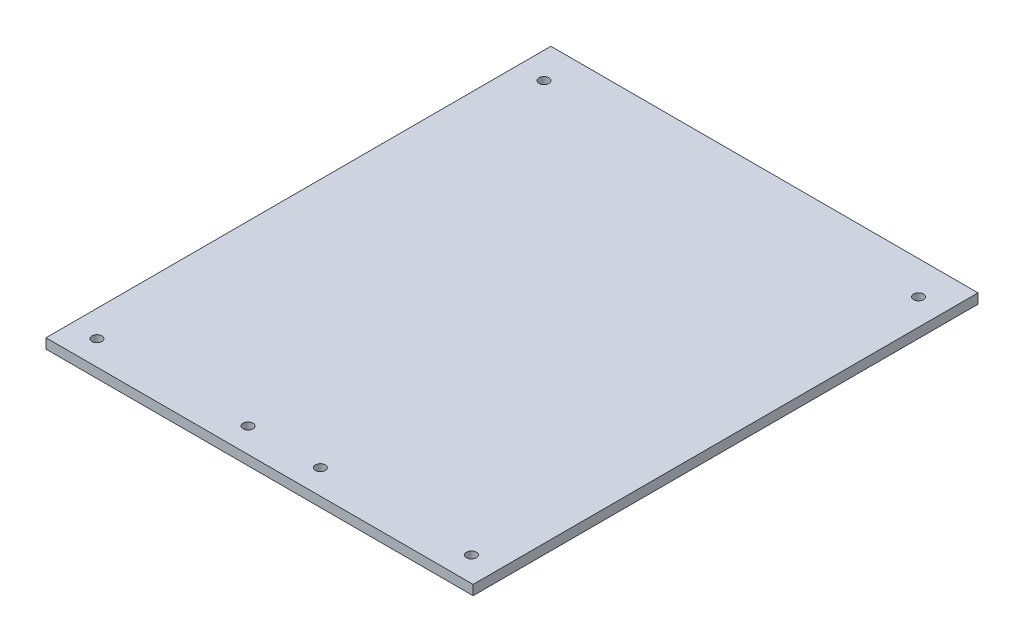
ISO-10303-21;
HEADER;
FILE_DESCRIPTION(('STEP AP214'),'2;1');
FILE_NAME('part.step','',(''),(''),'','','');
FILE_SCHEMA(('AUTOMOTIVE_DESIGN { 1 0 10303 214 1 1 1 1 }'));
ENDSEC;
DATA;
#1=APPLICATION_CONTEXT('core data for automotive mechanical design processes');
#2=APPLICATION_PROTOCOL_DEFINITION('international standard','automotive_design',2000,#1);
#3=PRODUCT_CONTEXT('',#1,'mechanical');
#4=PRODUCT('Part','Part','',(#3));
#5=PRODUCT_RELATED_PRODUCT_CATEGORY('part','',(#4));
#6=PRODUCT_DEFINITION_FORMATION('','',#4);
#7=PRODUCT_DEFINITION_CONTEXT('part definition',#1,'design');
#8=PRODUCT_DEFINITION('design','',#6,#7);
#9=PRODUCT_DEFINITION_SHAPE('','',#8);
#10=(LENGTH_UNIT() NAMED_UNIT(*) SI_UNIT(.MILLI.,.METRE.));
#11=(NAMED_UNIT(*) PLANE_ANGLE_UNIT() SI_UNIT($,.RADIAN.));
#12=(NAMED_UNIT(*) SI_UNIT($,.STERADIAN.) SOLID_ANGLE_UNIT());
#13=UNCERTAINTY_MEASURE_WITH_UNIT(LENGTH_MEASURE(1.E-05),#10,'distance_accuracy_value','');
#14=(GEOMETRIC_REPRESENTATION_CONTEXT(3) GLOBAL_UNCERTAINTY_ASSIGNED_CONTEXT((#13)) GLOBAL_UNIT_ASSIGNED_CONTEXT((#10,
#11,#12)) REPRESENTATION_CONTEXT('',''));
#15=CARTESIAN_POINT('',(0.,0.,0.));
#16=DIRECTION('',(0.,0.,1.));
#17=DIRECTION('',(1.,0.,0.));
#18=AXIS2_PLACEMENT_3D('',#15,#16,#17);
#19=CARTESIAN_POINT('',(0.,3.,0.));
#20=DIRECTION('',(0.,-1.,0.));
#21=DIRECTION('',(0.,0.,-1.));
#22=AXIS2_PLACEMENT_3D('',#19,#20,#21);
#23=PLANE('',#22);
#24=DIRECTION('',(0.,0.,1.));
#25=VECTOR('',#24,1.);
#26=CARTESIAN_POINT('',(0.,3.,0.));
#27=LINE('',#26,#25);
#28=CARTESIAN_POINT('',(0.,3.,-153.666));
#29=VERTEX_POINT('',#28);
#30=CARTESIAN_POINT('',(0.,3.,0.));
#31=VERTEX_POINT('',#30);
#32=EDGE_CURVE('E89',#29,#31,#27,.T.);
#33=ORIENTED_EDGE('',*,*,#32,.T.);
#34=DIRECTION('',(1.,0.,0.));
#35=VECTOR('',#34,1.);
#36=CARTESIAN_POINT('',(0.,3.,0.));
#37=LINE('',#36,#35);
#38=CARTESIAN_POINT('',(130.,3.,0.));
#39=VERTEX_POINT('',#38);
#40=EDGE_CURVE('E84',#31,#39,#37,.T.);
#41=ORIENTED_EDGE('',*,*,#40,.T.);
#42=DIRECTION('',(0.,0.,-1.));
#43=VECTOR('',#42,1.);
#44=CARTESIAN_POINT('',(130.,3.,0.));
#45=LINE('',#44,#43);
#46=CARTESIAN_POINT('',(130.,3.,-153.666));
#47=VERTEX_POINT('',#46);
#48=EDGE_CURVE('E87',#39,#47,#45,.T.);
#49=ORIENTED_EDGE('',*,*,#48,.T.);
#50=DIRECTION('',(-1.,0.,0.));
#51=VECTOR('',#50,1.);
#52=CARTESIAN_POINT('',(0.,3.,-153.666));
#53=LINE('',#52,#51);
#54=EDGE_CURVE('E54',#47,#29,#53,.T.);
#55=ORIENTED_EDGE('',*,*,#54,.T.);
#56=EDGE_LOOP('',(#33,#41,#49,#55));
#57=FACE_BOUND('',#56,.T.);
#58=CARTESIAN_POINT('',(8.,3.,-143.566));
#59=DIRECTION('',(0.,1.,0.));
#60=DIRECTION('',(0.,0.,1.));
#61=AXIS2_PLACEMENT_3D('',#58,#59,#60);
#62=CIRCLE('',#61,1.5);
#63=CARTESIAN_POINT('',(8.,3.,-142.066));
#64=VERTEX_POINT('',#63);
#65=EDGE_CURVE('E104',#64,#64,#62,.T.);
#66=ORIENTED_EDGE('',*,*,#65,.F.);
#67=EDGE_LOOP('',(#66));
#68=FACE_BOUND('',#67,.T.);
#69=CARTESIAN_POINT('',(8.,3.,-7.5));
#70=DIRECTION('',(0.,1.,0.));
#71=DIRECTION('',(0.,0.,1.));
#72=AXIS2_PLACEMENT_3D('',#69,#70,#71);
#73=CIRCLE('',#72,1.5);
#74=CARTESIAN_POINT('',(8.,3.,-6.));
#75=VERTEX_POINT('',#74);
#76=EDGE_CURVE('E119',#75,#75,#73,.T.);
#77=ORIENTED_EDGE('',*,*,#76,.F.);
#78=EDGE_LOOP('',(#77));
#79=FACE_BOUND('',#78,.T.);
#80=CARTESIAN_POINT('',(54.,3.,-7.5));
#81=DIRECTION('',(0.,1.,0.));
#82=DIRECTION('',(0.,0.,1.));
#83=AXIS2_PLACEMENT_3D('',#80,#81,#82);
#84=CIRCLE('',#83,1.5);
#85=CARTESIAN_POINT('',(54.,3.,-6.));
#86=VERTEX_POINT('',#85);
#87=EDGE_CURVE('E125',#86,#86,#84,.T.);
#88=ORIENTED_EDGE('',*,*,#87,.F.);
#89=EDGE_LOOP('',(#88));
#90=FACE_BOUND('',#89,.T.);
#91=CARTESIAN_POINT('',(122.,3.,-7.5));
#92=DIRECTION('',(0.,1.,0.));
#93=DIRECTION('',(0.,0.,-1.));
#94=AXIS2_PLACEMENT_3D('',#91,#92,#93);
#95=CIRCLE('',#94,1.5);
#96=CARTESIAN_POINT('',(122.,3.,-9.));
#97=VERTEX_POINT('',#96);
#98=EDGE_CURVE('E131',#97,#97,#95,.T.);
#99=ORIENTED_EDGE('',*,*,#98,.F.);
#100=EDGE_LOOP('',(#99));
#101=FACE_BOUND('',#100,.T.);
#102=CARTESIAN_POINT('',(76.,3.,-7.5));
#103=DIRECTION('',(0.,1.,0.));
#104=DIRECTION('',(0.,0.,-1.));
#105=AXIS2_PLACEMENT_3D('',#102,#103,#104);
#106=CIRCLE('',#105,1.50000000000001);
#107=CARTESIAN_POINT('',(76.,3.,-9.00000000000001));
#108=VERTEX_POINT('',#107);
#109=EDGE_CURVE('E137',#108,#108,#106,.T.);
#110=ORIENTED_EDGE('',*,*,#109,.F.);
#111=EDGE_LOOP('',(#110));
#112=FACE_BOUND('',#111,.T.);
#113=CARTESIAN_POINT('',(122.,3.,-143.566));
#114=DIRECTION('',(0.,1.,0.));
#115=DIRECTION('',(0.,0.,-1.));
#116=AXIS2_PLACEMENT_3D('',#113,#114,#115);
#117=CIRCLE('',#116,1.5);
#118=CARTESIAN_POINT('',(122.,3.,-145.066));
#119=VERTEX_POINT('',#118);
#120=EDGE_CURVE('E143',#119,#119,#117,.T.);
#121=ORIENTED_EDGE('',*,*,#120,.F.);
#122=EDGE_LOOP('',(#121));
#123=FACE_BOUND('',#122,.T.);
#124=ADVANCED_FACE('F37',(#57,#68,#79,#90,#101,#112,#123),#23,.F.);
#125=CARTESIAN_POINT('',(0.,0.,0.));
#126=DIRECTION('',(0.,-1.,0.));
#127=DIRECTION('',(0.,0.,-1.));
#128=AXIS2_PLACEMENT_3D('',#125,#126,#127);
#129=PLANE('',#128);
#130=CARTESIAN_POINT('',(76.,0.,-7.5));
#131=DIRECTION('',(0.,1.,0.));
#132=DIRECTION('',(0.,0.,-1.));
#133=AXIS2_PLACEMENT_3D('',#130,#131,#132);
#134=CIRCLE('',#133,1.50000000000001);
#135=CARTESIAN_POINT('',(76.,0.,-9.00000000000001));
#136=VERTEX_POINT('',#135);
#137=EDGE_CURVE('E140',#136,#136,#134,.T.);
#138=ORIENTED_EDGE('',*,*,#137,.T.);
#139=EDGE_LOOP('',(#138));
#140=FACE_BOUND('',#139,.T.);
#141=CARTESIAN_POINT('',(54.,0.,-7.5));
#142=DIRECTION('',(0.,1.,0.));
#143=DIRECTION('',(0.,0.,1.));
#144=AXIS2_PLACEMENT_3D('',#141,#142,#143);
#145=CIRCLE('',#144,1.5);
#146=CARTESIAN_POINT('',(54.,0.,-6.));
#147=VERTEX_POINT('',#146);
#148=EDGE_CURVE('E128',#147,#147,#145,.T.);
#149=ORIENTED_EDGE('',*,*,#148,.T.);
#150=EDGE_LOOP('',(#149));
#151=FACE_BOUND('',#150,.T.);
#152=CARTESIAN_POINT('',(8.,0.,-143.566));
#153=DIRECTION('',(0.,1.,0.));
#154=DIRECTION('',(0.,0.,1.));
#155=AXIS2_PLACEMENT_3D('',#152,#153,#154);
#156=CIRCLE('',#155,1.5);
#157=CARTESIAN_POINT('',(8.,0.,-142.066));
#158=VERTEX_POINT('',#157);
#159=EDGE_CURVE('E116',#158,#158,#156,.T.);
#160=ORIENTED_EDGE('',*,*,#159,.T.);
#161=EDGE_LOOP('',(#160));
#162=FACE_BOUND('',#161,.T.);
#163=DIRECTION('',(0.,0.,1.));
#164=VECTOR('',#163,1.);
#165=CARTESIAN_POINT('',(0.,0.,0.));
#166=LINE('',#165,#164);
#167=CARTESIAN_POINT('',(0.,0.,-153.666));
#168=VERTEX_POINT('',#167);
#169=CARTESIAN_POINT('',(0.,0.,0.));
#170=VERTEX_POINT('',#169);
#171=EDGE_CURVE('E101',#168,#170,#166,.T.);
#172=ORIENTED_EDGE('',*,*,#171,.F.);
#173=DIRECTION('',(-1.,0.,0.));
#174=VECTOR('',#173,1.);
#175=CARTESIAN_POINT('',(0.,0.,-153.666));
#176=LINE('',#175,#174);
#177=CARTESIAN_POINT('',(130.,0.,-153.666));
#178=VERTEX_POINT('',#177);
#179=EDGE_CURVE('E77',#178,#168,#176,.T.);
#180=ORIENTED_EDGE('',*,*,#179,.F.);
#181=DIRECTION('',(0.,0.,-1.));
#182=VECTOR('',#181,1.);
#183=CARTESIAN_POINT('',(130.,0.,0.));
#184=LINE('',#183,#182);
#185=CARTESIAN_POINT('',(130.,0.,0.));
#186=VERTEX_POINT('',#185);
#187=EDGE_CURVE('E71',#186,#178,#184,.T.);
#188=ORIENTED_EDGE('',*,*,#187,.F.);
#189=DIRECTION('',(1.,0.,0.));
#190=VECTOR('',#189,1.);
#191=CARTESIAN_POINT('',(0.,0.,0.));
#192=LINE('',#191,#190);
#193=EDGE_CURVE('E93',#170,#186,#192,.T.);
#194=ORIENTED_EDGE('',*,*,#193,.F.);
#195=EDGE_LOOP('',(#172,#180,#188,#194));
#196=FACE_BOUND('',#195,.T.);
#197=CARTESIAN_POINT('',(8.,0.,-7.5));
#198=DIRECTION('',(0.,1.,0.));
#199=DIRECTION('',(0.,0.,1.));
#200=AXIS2_PLACEMENT_3D('',#197,#198,#199);
#201=CIRCLE('',#200,1.5);
#202=CARTESIAN_POINT('',(8.,0.,-6.));
#203=VERTEX_POINT('',#202);
#204=EDGE_CURVE('E122',#203,#203,#201,.T.);
#205=ORIENTED_EDGE('',*,*,#204,.T.);
#206=EDGE_LOOP('',(#205));
#207=FACE_BOUND('',#206,.T.);
#208=CARTESIAN_POINT('',(122.,0.,-7.5));
#209=DIRECTION('',(0.,1.,0.));
#210=DIRECTION('',(0.,0.,-1.));
#211=AXIS2_PLACEMENT_3D('',#208,#209,#210);
#212=CIRCLE('',#211,1.5);
#213=CARTESIAN_POINT('',(122.,0.,-9.));
#214=VERTEX_POINT('',#213);
#215=EDGE_CURVE('E134',#214,#214,#212,.T.);
#216=ORIENTED_EDGE('',*,*,#215,.T.);
#217=EDGE_LOOP('',(#216));
#218=FACE_BOUND('',#217,.T.);
#219=CARTESIAN_POINT('',(122.,0.,-143.566));
#220=DIRECTION('',(0.,1.,0.));
#221=DIRECTION('',(0.,0.,-1.));
#222=AXIS2_PLACEMENT_3D('',#219,#220,#221);
#223=CIRCLE('',#222,1.5);
#224=CARTESIAN_POINT('',(122.,0.,-145.066));
#225=VERTEX_POINT('',#224);
#226=EDGE_CURVE('E146',#225,#225,#223,.T.);
#227=ORIENTED_EDGE('',*,*,#226,.T.);
#228=EDGE_LOOP('',(#227));
#229=FACE_BOUND('',#228,.T.);
#230=ADVANCED_FACE('F112',(#140,#151,#162,#196,#207,#218,#229),#129,.T.);
#231=CARTESIAN_POINT('',(0.,3.,0.));
#232=DIRECTION('',(1.,0.,0.));
#233=DIRECTION('',(0.,0.,-1.));
#234=AXIS2_PLACEMENT_3D('',#231,#232,#233);
#235=PLANE('',#234);
#236=ORIENTED_EDGE('',*,*,#171,.T.);
#237=DIRECTION('',(0.,-1.,0.));
#238=VECTOR('',#237,1.);
#239=CARTESIAN_POINT('',(0.,3.,0.));
#240=LINE('',#239,#238);
#241=EDGE_CURVE('E11',#31,#170,#240,.T.);
#242=ORIENTED_EDGE('',*,*,#241,.F.);
#243=ORIENTED_EDGE('',*,*,#32,.F.);
#244=DIRECTION('',(0.,-1.,0.));
#245=VECTOR('',#244,1.);
#246=CARTESIAN_POINT('',(0.,3.,-153.666));
#247=LINE('',#246,#245);
#248=EDGE_CURVE('E97',#29,#168,#247,.T.);
#249=ORIENTED_EDGE('',*,*,#248,.T.);
#250=EDGE_LOOP('',(#236,#242,#243,#249));
#251=FACE_BOUND('',#250,.T.);
#252=ADVANCED_FACE('F39',(#251),#235,.F.);
#253=CARTESIAN_POINT('',(0.,3.,0.));
#254=DIRECTION('',(0.,0.,-1.));
#255=DIRECTION('',(-1.,0.,0.));
#256=AXIS2_PLACEMENT_3D('',#253,#254,#255);
#257=PLANE('',#256);
#258=ORIENTED_EDGE('',*,*,#193,.T.);
#259=DIRECTION('',(0.,-1.,0.));
#260=VECTOR('',#259,1.);
#261=CARTESIAN_POINT('',(130.,3.,0.));
#262=LINE('',#261,#260);
#263=EDGE_CURVE('E46',#39,#186,#262,.T.);
#264=ORIENTED_EDGE('',*,*,#263,.F.);
#265=ORIENTED_EDGE('',*,*,#40,.F.);
#266=ORIENTED_EDGE('',*,*,#241,.T.);
#267=EDGE_LOOP('',(#258,#264,#265,#266));
#268=FACE_BOUND('',#267,.T.);
#269=ADVANCED_FACE('F92',(#268),#257,.F.);
#270=CARTESIAN_POINT('',(130.,3.,0.));
#271=DIRECTION('',(-1.,0.,0.));
#272=DIRECTION('',(0.,0.,1.));
#273=AXIS2_PLACEMENT_3D('',#270,#271,#272);
#274=PLANE('',#273);
#275=ORIENTED_EDGE('',*,*,#187,.T.);
#276=DIRECTION('',(0.,-1.,0.));
#277=VECTOR('',#276,1.);
#278=CARTESIAN_POINT('',(130.,3.,-153.666));
#279=LINE('',#278,#277);
#280=EDGE_CURVE('E94',#47,#178,#279,.T.);
#281=ORIENTED_EDGE('',*,*,#280,.F.);
#282=ORIENTED_EDGE('',*,*,#48,.F.);
#283=ORIENTED_EDGE('',*,*,#263,.T.);
#284=EDGE_LOOP('',(#275,#281,#282,#283));
#285=FACE_BOUND('',#284,.T.);
#286=ADVANCED_FACE('F95',(#285),#274,.F.);
#287=CARTESIAN_POINT('',(0.,3.,-153.666));
#288=DIRECTION('',(0.,0.,1.));
#289=DIRECTION('',(1.,0.,0.));
#290=AXIS2_PLACEMENT_3D('',#287,#288,#289);
#291=PLANE('',#290);
#292=ORIENTED_EDGE('',*,*,#179,.T.);
#293=ORIENTED_EDGE('',*,*,#248,.F.);
#294=ORIENTED_EDGE('',*,*,#54,.F.);
#295=ORIENTED_EDGE('',*,*,#280,.T.);
#296=EDGE_LOOP('',(#292,#293,#294,#295));
#297=FACE_BOUND('',#296,.T.);
#298=ADVANCED_FACE('F109',(#297),#291,.F.);
#299=CARTESIAN_POINT('',(8.,3.,-143.566));
#300=DIRECTION('',(0.,-1.,0.));
#301=DIRECTION('',(0.,0.,-1.));
#302=AXIS2_PLACEMENT_3D('',#299,#300,#301);
#303=CYLINDRICAL_SURFACE('',#302,1.5);
#304=ORIENTED_EDGE('',*,*,#65,.T.);
#305=EDGE_LOOP('',(#304));
#306=FACE_BOUND('',#305,.T.);
#307=ORIENTED_EDGE('',*,*,#159,.F.);
#308=EDGE_LOOP('',(#307));
#309=FACE_BOUND('',#308,.T.);
#310=ADVANCED_FACE('F163',(#306,#309),#303,.F.);
#311=CARTESIAN_POINT('',(8.,3.,-7.5));
#312=DIRECTION('',(0.,-1.,0.));
#313=DIRECTION('',(0.,0.,-1.));
#314=AXIS2_PLACEMENT_3D('',#311,#312,#313);
#315=CYLINDRICAL_SURFACE('',#314,1.5);
#316=ORIENTED_EDGE('',*,*,#76,.T.);
#317=EDGE_LOOP('',(#316));
#318=FACE_BOUND('',#317,.T.);
#319=ORIENTED_EDGE('',*,*,#204,.F.);
#320=EDGE_LOOP('',(#319));
#321=FACE_BOUND('',#320,.T.);
#322=ADVANCED_FACE('F209',(#318,#321),#315,.F.);
#323=CARTESIAN_POINT('',(54.,3.,-7.5));
#324=DIRECTION('',(0.,-1.,0.));
#325=DIRECTION('',(0.,0.,-1.));
#326=AXIS2_PLACEMENT_3D('',#323,#324,#325);
#327=CYLINDRICAL_SURFACE('',#326,1.5);
#328=ORIENTED_EDGE('',*,*,#87,.T.);
#329=EDGE_LOOP('',(#328));
#330=FACE_BOUND('',#329,.T.);
#331=ORIENTED_EDGE('',*,*,#148,.F.);
#332=EDGE_LOOP('',(#331));
#333=FACE_BOUND('',#332,.T.);
#334=ADVANCED_FACE('F217',(#330,#333),#327,.F.);
#335=CARTESIAN_POINT('',(122.,3.,-7.5));
#336=DIRECTION('',(0.,-1.,0.));
#337=DIRECTION('',(0.,0.,-1.));
#338=AXIS2_PLACEMENT_3D('',#335,#336,#337);
#339=CYLINDRICAL_SURFACE('',#338,1.5);
#340=ORIENTED_EDGE('',*,*,#98,.T.);
#341=EDGE_LOOP('',(#340));
#342=FACE_BOUND('',#341,.T.);
#343=ORIENTED_EDGE('',*,*,#215,.F.);
#344=EDGE_LOOP('',(#343));
#345=FACE_BOUND('',#344,.T.);
#346=ADVANCED_FACE('F225',(#342,#345),#339,.F.);
#347=CARTESIAN_POINT('',(76.,3.,-7.5));
#348=DIRECTION('',(0.,-1.,0.));
#349=DIRECTION('',(0.,0.,-1.));
#350=AXIS2_PLACEMENT_3D('',#347,#348,#349);
#351=CYLINDRICAL_SURFACE('',#350,1.50000000000001);
#352=ORIENTED_EDGE('',*,*,#109,.T.);
#353=EDGE_LOOP('',(#352));
#354=FACE_BOUND('',#353,.T.);
#355=ORIENTED_EDGE('',*,*,#137,.F.);
#356=EDGE_LOOP('',(#355));
#357=FACE_BOUND('',#356,.T.);
#358=ADVANCED_FACE('F234',(#354,#357),#351,.F.);
#359=CARTESIAN_POINT('',(122.,3.,-143.566));
#360=DIRECTION('',(0.,-1.,0.));
#361=DIRECTION('',(0.,0.,-1.));
#362=AXIS2_PLACEMENT_3D('',#359,#360,#361);
#363=CYLINDRICAL_SURFACE('',#362,1.5);
#364=ORIENTED_EDGE('',*,*,#120,.T.);
#365=EDGE_LOOP('',(#364));
#366=FACE_BOUND('',#365,.T.);
#367=ORIENTED_EDGE('',*,*,#226,.F.);
#368=EDGE_LOOP('',(#367));
#369=FACE_BOUND('',#368,.T.);
#370=ADVANCED_FACE('F152',(#366,#369),#363,.F.);
#371=CLOSED_SHELL('',(#124,#230,#252,#269,#286,#298,#310,#322,#334,#346,#358,#370));
#372=MANIFOLD_SOLID_BREP('B2',#371);
#373=ADVANCED_BREP_SHAPE_REPRESENTATION('',(#18,#372),#14);
#374=SHAPE_DEFINITION_REPRESENTATION(#9,#373);
ENDSEC;
END-ISO-10303-21;
